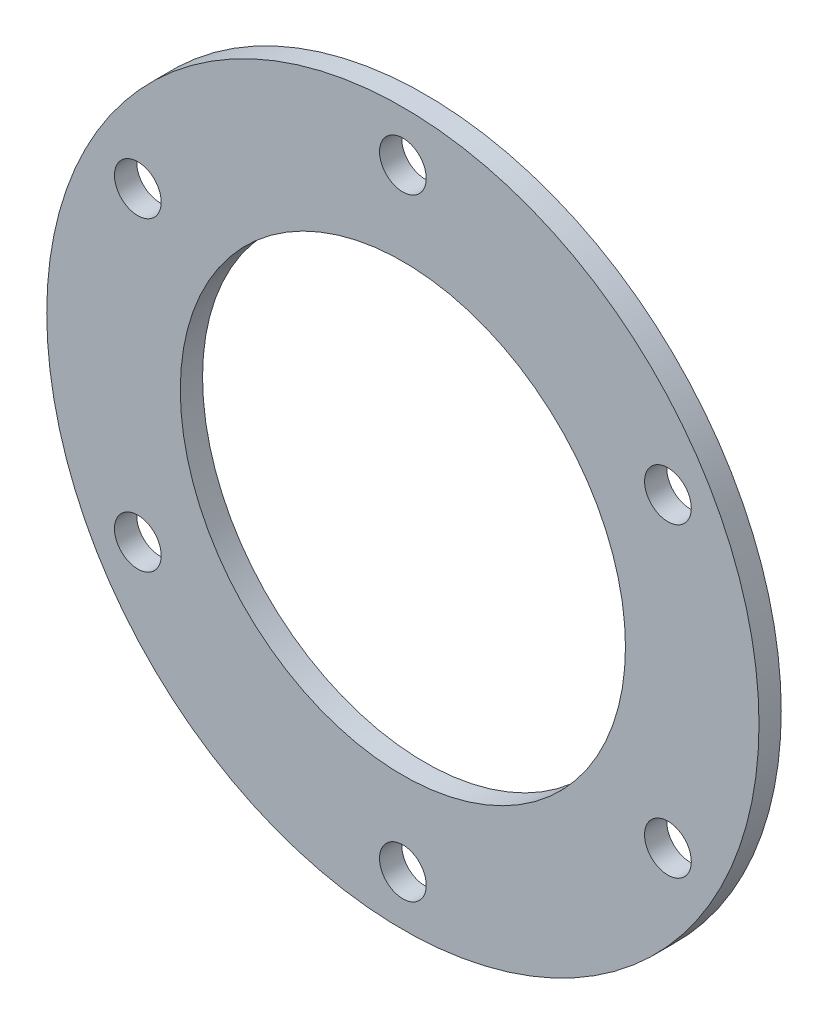
ISO-10303-21;
HEADER;
FILE_DESCRIPTION(('STEP AP214'),'2;1');
FILE_NAME('part.step','',(''),(''),'','','');
FILE_SCHEMA(('AUTOMOTIVE_DESIGN { 1 0 10303 214 1 1 1 1 }'));
ENDSEC;
DATA;
#1=APPLICATION_CONTEXT('core data for automotive mechanical design processes');
#2=APPLICATION_PROTOCOL_DEFINITION('international standard','automotive_design',2000,#1);
#3=PRODUCT_CONTEXT('',#1,'mechanical');
#4=PRODUCT('Part','Part','',(#3));
#5=PRODUCT_RELATED_PRODUCT_CATEGORY('part','',(#4));
#6=PRODUCT_DEFINITION_FORMATION('','',#4);
#7=PRODUCT_DEFINITION_CONTEXT('part definition',#1,'design');
#8=PRODUCT_DEFINITION('design','',#6,#7);
#9=PRODUCT_DEFINITION_SHAPE('','',#8);
#10=(LENGTH_UNIT() NAMED_UNIT(*) SI_UNIT(.MILLI.,.METRE.));
#11=(NAMED_UNIT(*) PLANE_ANGLE_UNIT() SI_UNIT($,.RADIAN.));
#12=(NAMED_UNIT(*) SI_UNIT($,.STERADIAN.) SOLID_ANGLE_UNIT());
#13=UNCERTAINTY_MEASURE_WITH_UNIT(LENGTH_MEASURE(1.E-05),#10,'distance_accuracy_value','');
#14=(GEOMETRIC_REPRESENTATION_CONTEXT(3) GLOBAL_UNCERTAINTY_ASSIGNED_CONTEXT((#13)) GLOBAL_UNIT_ASSIGNED_CONTEXT((#10,
#11,#12)) REPRESENTATION_CONTEXT('',''));
#15=CARTESIAN_POINT('',(0.,0.,0.));
#16=DIRECTION('',(0.,0.,1.));
#17=DIRECTION('',(1.,0.,0.));
#18=AXIS2_PLACEMENT_3D('',#15,#16,#17);
#19=CARTESIAN_POINT('',(0.,0.,2.));
#20=DIRECTION('',(0.,0.,1.));
#21=DIRECTION('',(1.,0.,0.));
#22=AXIS2_PLACEMENT_3D('',#19,#20,#21);
#23=PLANE('',#22);
#24=CARTESIAN_POINT('',(23.8156986040719,13.7500000000003,2.));
#25=DIRECTION('',(0.,0.,1.));
#26=DIRECTION('',(1.,0.,0.));
#27=AXIS2_PLACEMENT_3D('',#24,#25,#26);
#28=CIRCLE('',#27,2.1);
#29=CARTESIAN_POINT('',(25.9156986040719,13.7500000000003,2.));
#30=VERTEX_POINT('',#29);
#31=EDGE_CURVE('E90',#30,#30,#28,.T.);
#32=ORIENTED_EDGE('',*,*,#31,.F.);
#33=EDGE_LOOP('',(#32));
#34=FACE_BOUND('',#33,.T.);
#35=CARTESIAN_POINT('',(23.8156986040722,-13.7499999999998,2.));
#36=DIRECTION('',(0.,0.,1.));
#37=DIRECTION('',(1.,0.,0.));
#38=AXIS2_PLACEMENT_3D('',#35,#36,#37);
#39=CIRCLE('',#38,2.1);
#40=CARTESIAN_POINT('',(25.9156986040722,-13.7499999999998,2.));
#41=VERTEX_POINT('',#40);
#42=EDGE_CURVE('E84',#41,#41,#39,.T.);
#43=ORIENTED_EDGE('',*,*,#42,.F.);
#44=EDGE_LOOP('',(#43));
#45=FACE_BOUND('',#44,.T.);
#46=CARTESIAN_POINT('',(0.,-27.5,2.));
#47=DIRECTION('',(0.,0.,1.));
#48=DIRECTION('',(1.,0.,0.));
#49=AXIS2_PLACEMENT_3D('',#46,#47,#48);
#50=CIRCLE('',#49,2.1);
#51=CARTESIAN_POINT('',(2.1,-27.5,2.));
#52=VERTEX_POINT('',#51);
#53=EDGE_CURVE('E78',#52,#52,#50,.T.);
#54=ORIENTED_EDGE('',*,*,#53,.F.);
#55=EDGE_LOOP('',(#54));
#56=FACE_BOUND('',#55,.T.);
#57=CARTESIAN_POINT('',(-23.815698604072,-13.7500000000001,2.));
#58=DIRECTION('',(0.,0.,1.));
#59=DIRECTION('',(1.,0.,0.));
#60=AXIS2_PLACEMENT_3D('',#57,#58,#59);
#61=CIRCLE('',#60,2.1);
#62=CARTESIAN_POINT('',(-21.715698604072,-13.7500000000001,2.));
#63=VERTEX_POINT('',#62);
#64=EDGE_CURVE('E72',#63,#63,#61,.T.);
#65=ORIENTED_EDGE('',*,*,#64,.F.);
#66=EDGE_LOOP('',(#65));
#67=FACE_BOUND('',#66,.T.);
#68=CARTESIAN_POINT('',(-23.8156986040721,13.7499999999999,2.));
#69=DIRECTION('',(0.,0.,1.));
#70=DIRECTION('',(1.,0.,0.));
#71=AXIS2_PLACEMENT_3D('',#68,#69,#70);
#72=CIRCLE('',#71,2.1);
#73=CARTESIAN_POINT('',(-21.7156986040721,13.7499999999999,2.));
#74=VERTEX_POINT('',#73);
#75=EDGE_CURVE('E66',#74,#74,#72,.T.);
#76=ORIENTED_EDGE('',*,*,#75,.F.);
#77=EDGE_LOOP('',(#76));
#78=FACE_BOUND('',#77,.T.);
#79=CARTESIAN_POINT('',(0.,27.5,2.));
#80=DIRECTION('',(0.,0.,1.));
#81=DIRECTION('',(1.,0.,0.));
#82=AXIS2_PLACEMENT_3D('',#79,#80,#81);
#83=CIRCLE('',#82,2.1);
#84=CARTESIAN_POINT('',(2.1,27.5,2.));
#85=VERTEX_POINT('',#84);
#86=EDGE_CURVE('E60',#85,#85,#83,.T.);
#87=ORIENTED_EDGE('',*,*,#86,.F.);
#88=EDGE_LOOP('',(#87));
#89=FACE_BOUND('',#88,.T.);
#90=CARTESIAN_POINT('',(0.,0.,2.));
#91=DIRECTION('',(0.,0.,1.));
#92=DIRECTION('',(1.,0.,0.));
#93=AXIS2_PLACEMENT_3D('',#90,#91,#92);
#94=CIRCLE('',#93,32.);
#95=CARTESIAN_POINT('',(32.,0.,2.));
#96=VERTEX_POINT('',#95);
#97=EDGE_CURVE('E10',#96,#96,#94,.T.);
#98=ORIENTED_EDGE('',*,*,#97,.T.);
#99=EDGE_LOOP('',(#98));
#100=FACE_BOUND('',#99,.T.);
#101=CARTESIAN_POINT('',(0.,0.,2.));
#102=DIRECTION('',(0.,0.,1.));
#103=DIRECTION('',(1.,0.,0.));
#104=AXIS2_PLACEMENT_3D('',#101,#102,#103);
#105=CIRCLE('',#104,20.);
#106=CARTESIAN_POINT('',(20.,0.,2.));
#107=VERTEX_POINT('',#106);
#108=EDGE_CURVE('E50',#107,#107,#105,.T.);
#109=ORIENTED_EDGE('',*,*,#108,.F.);
#110=EDGE_LOOP('',(#109));
#111=FACE_BOUND('',#110,.T.);
#112=ADVANCED_FACE('F39',(#34,#45,#56,#67,#78,#89,#100,#111),#23,.T.);
#113=CARTESIAN_POINT('',(0.,0.,0.));
#114=DIRECTION('',(0.,0.,1.));
#115=DIRECTION('',(1.,0.,0.));
#116=AXIS2_PLACEMENT_3D('',#113,#114,#115);
#117=PLANE('',#116);
#118=CARTESIAN_POINT('',(23.8156986040719,13.7500000000003,0.));
#119=DIRECTION('',(0.,0.,1.));
#120=DIRECTION('',(1.,0.,0.));
#121=AXIS2_PLACEMENT_3D('',#118,#119,#120);
#122=CIRCLE('',#121,2.1);
#123=CARTESIAN_POINT('',(25.9156986040719,13.7500000000003,0.));
#124=VERTEX_POINT('',#123);
#125=EDGE_CURVE('E87',#124,#124,#122,.T.);
#126=ORIENTED_EDGE('',*,*,#125,.T.);
#127=EDGE_LOOP('',(#126));
#128=FACE_BOUND('',#127,.T.);
#129=CARTESIAN_POINT('',(23.8156986040722,-13.7499999999998,0.));
#130=DIRECTION('',(0.,0.,1.));
#131=DIRECTION('',(1.,0.,0.));
#132=AXIS2_PLACEMENT_3D('',#129,#130,#131);
#133=CIRCLE('',#132,2.1);
#134=CARTESIAN_POINT('',(25.9156986040722,-13.7499999999998,0.));
#135=VERTEX_POINT('',#134);
#136=EDGE_CURVE('E81',#135,#135,#133,.T.);
#137=ORIENTED_EDGE('',*,*,#136,.T.);
#138=EDGE_LOOP('',(#137));
#139=FACE_BOUND('',#138,.T.);
#140=CARTESIAN_POINT('',(0.,-27.5,0.));
#141=DIRECTION('',(0.,0.,1.));
#142=DIRECTION('',(1.,0.,0.));
#143=AXIS2_PLACEMENT_3D('',#140,#141,#142);
#144=CIRCLE('',#143,2.1);
#145=CARTESIAN_POINT('',(2.1,-27.5,0.));
#146=VERTEX_POINT('',#145);
#147=EDGE_CURVE('E75',#146,#146,#144,.T.);
#148=ORIENTED_EDGE('',*,*,#147,.T.);
#149=EDGE_LOOP('',(#148));
#150=FACE_BOUND('',#149,.T.);
#151=CARTESIAN_POINT('',(-23.815698604072,-13.7500000000001,0.));
#152=DIRECTION('',(0.,0.,1.));
#153=DIRECTION('',(1.,0.,0.));
#154=AXIS2_PLACEMENT_3D('',#151,#152,#153);
#155=CIRCLE('',#154,2.1);
#156=CARTESIAN_POINT('',(-21.715698604072,-13.7500000000001,0.));
#157=VERTEX_POINT('',#156);
#158=EDGE_CURVE('E69',#157,#157,#155,.T.);
#159=ORIENTED_EDGE('',*,*,#158,.T.);
#160=EDGE_LOOP('',(#159));
#161=FACE_BOUND('',#160,.T.);
#162=CARTESIAN_POINT('',(-23.8156986040721,13.7499999999999,0.));
#163=DIRECTION('',(0.,0.,1.));
#164=DIRECTION('',(1.,0.,0.));
#165=AXIS2_PLACEMENT_3D('',#162,#163,#164);
#166=CIRCLE('',#165,2.1);
#167=CARTESIAN_POINT('',(-21.7156986040721,13.7499999999999,0.));
#168=VERTEX_POINT('',#167);
#169=EDGE_CURVE('E63',#168,#168,#166,.T.);
#170=ORIENTED_EDGE('',*,*,#169,.T.);
#171=EDGE_LOOP('',(#170));
#172=FACE_BOUND('',#171,.T.);
#173=CARTESIAN_POINT('',(0.,27.5,0.));
#174=DIRECTION('',(0.,0.,1.));
#175=DIRECTION('',(1.,0.,0.));
#176=AXIS2_PLACEMENT_3D('',#173,#174,#175);
#177=CIRCLE('',#176,2.1);
#178=CARTESIAN_POINT('',(2.1,27.5,0.));
#179=VERTEX_POINT('',#178);
#180=EDGE_CURVE('E55',#179,#179,#177,.T.);
#181=ORIENTED_EDGE('',*,*,#180,.T.);
#182=EDGE_LOOP('',(#181));
#183=FACE_BOUND('',#182,.T.);
#184=CARTESIAN_POINT('',(0.,0.,0.));
#185=DIRECTION('',(0.,0.,1.));
#186=DIRECTION('',(1.,0.,0.));
#187=AXIS2_PLACEMENT_3D('',#184,#185,#186);
#188=CIRCLE('',#187,32.);
#189=CARTESIAN_POINT('',(32.,0.,0.));
#190=VERTEX_POINT('',#189);
#191=EDGE_CURVE('E43',#190,#190,#188,.T.);
#192=ORIENTED_EDGE('',*,*,#191,.F.);
#193=EDGE_LOOP('',(#192));
#194=FACE_BOUND('',#193,.T.);
#195=CARTESIAN_POINT('',(0.,0.,0.));
#196=DIRECTION('',(0.,0.,1.));
#197=DIRECTION('',(1.,0.,0.));
#198=AXIS2_PLACEMENT_3D('',#195,#196,#197);
#199=CIRCLE('',#198,20.);
#200=CARTESIAN_POINT('',(20.,0.,0.));
#201=VERTEX_POINT('',#200);
#202=EDGE_CURVE('E52',#201,#201,#199,.T.);
#203=ORIENTED_EDGE('',*,*,#202,.T.);
#204=EDGE_LOOP('',(#203));
#205=FACE_BOUND('',#204,.T.);
#206=ADVANCED_FACE('F98',(#128,#139,#150,#161,#172,#183,#194,#205),#117,.F.);
#207=CARTESIAN_POINT('',(0.,0.,2.));
#208=DIRECTION('',(0.,0.,-1.));
#209=DIRECTION('',(-1.,0.,0.));
#210=AXIS2_PLACEMENT_3D('',#207,#208,#209);
#211=CYLINDRICAL_SURFACE('',#210,32.);
#212=ORIENTED_EDGE('',*,*,#97,.F.);
#213=EDGE_LOOP('',(#212));
#214=FACE_BOUND('',#213,.T.);
#215=ORIENTED_EDGE('',*,*,#191,.T.);
#216=EDGE_LOOP('',(#215));
#217=FACE_BOUND('',#216,.T.);
#218=ADVANCED_FACE('F41',(#214,#217),#211,.T.);
#219=CARTESIAN_POINT('',(0.,0.,2.));
#220=DIRECTION('',(0.,0.,-1.));
#221=DIRECTION('',(-1.,0.,0.));
#222=AXIS2_PLACEMENT_3D('',#219,#220,#221);
#223=CYLINDRICAL_SURFACE('',#222,20.);
#224=ORIENTED_EDGE('',*,*,#108,.T.);
#225=EDGE_LOOP('',(#224));
#226=FACE_BOUND('',#225,.T.);
#227=ORIENTED_EDGE('',*,*,#202,.F.);
#228=EDGE_LOOP('',(#227));
#229=FACE_BOUND('',#228,.T.);
#230=ADVANCED_FACE('F112',(#226,#229),#223,.F.);
#231=CARTESIAN_POINT('',(0.,27.5,2.));
#232=DIRECTION('',(0.,0.,1.));
#233=DIRECTION('',(1.,0.,0.));
#234=AXIS2_PLACEMENT_3D('',#231,#232,#233);
#235=CYLINDRICAL_SURFACE('',#234,2.1);
#236=ORIENTED_EDGE('',*,*,#180,.F.);
#237=EDGE_LOOP('',(#236));
#238=FACE_BOUND('',#237,.T.);
#239=ORIENTED_EDGE('',*,*,#86,.T.);
#240=EDGE_LOOP('',(#239));
#241=FACE_BOUND('',#240,.T.);
#242=ADVANCED_FACE('F115',(#238,#241),#235,.F.);
#243=CARTESIAN_POINT('',(-23.8156986040721,13.7499999999999,2.));
#244=DIRECTION('',(0.,0.,1.));
#245=DIRECTION('',(1.,0.,0.));
#246=AXIS2_PLACEMENT_3D('',#243,#244,#245);
#247=CYLINDRICAL_SURFACE('',#246,2.1);
#248=ORIENTED_EDGE('',*,*,#169,.F.);
#249=EDGE_LOOP('',(#248));
#250=FACE_BOUND('',#249,.T.);
#251=ORIENTED_EDGE('',*,*,#75,.T.);
#252=EDGE_LOOP('',(#251));
#253=FACE_BOUND('',#252,.T.);
#254=ADVANCED_FACE('F130',(#250,#253),#247,.F.);
#255=CARTESIAN_POINT('',(-23.815698604072,-13.7500000000001,2.));
#256=DIRECTION('',(0.,0.,1.));
#257=DIRECTION('',(1.,0.,0.));
#258=AXIS2_PLACEMENT_3D('',#255,#256,#257);
#259=CYLINDRICAL_SURFACE('',#258,2.1);
#260=ORIENTED_EDGE('',*,*,#158,.F.);
#261=EDGE_LOOP('',(#260));
#262=FACE_BOUND('',#261,.T.);
#263=ORIENTED_EDGE('',*,*,#64,.T.);
#264=EDGE_LOOP('',(#263));
#265=FACE_BOUND('',#264,.T.);
#266=ADVANCED_FACE('F133',(#262,#265),#259,.F.);
#267=CARTESIAN_POINT('',(0.,-27.5,2.));
#268=DIRECTION('',(0.,0.,1.));
#269=DIRECTION('',(1.,0.,0.));
#270=AXIS2_PLACEMENT_3D('',#267,#268,#269);
#271=CYLINDRICAL_SURFACE('',#270,2.1);
#272=ORIENTED_EDGE('',*,*,#147,.F.);
#273=EDGE_LOOP('',(#272));
#274=FACE_BOUND('',#273,.T.);
#275=ORIENTED_EDGE('',*,*,#53,.T.);
#276=EDGE_LOOP('',(#275));
#277=FACE_BOUND('',#276,.T.);
#278=ADVANCED_FACE('F137',(#274,#277),#271,.F.);
#279=CARTESIAN_POINT('',(23.8156986040722,-13.7499999999998,2.));
#280=DIRECTION('',(0.,0.,1.));
#281=DIRECTION('',(1.,0.,0.));
#282=AXIS2_PLACEMENT_3D('',#279,#280,#281);
#283=CYLINDRICAL_SURFACE('',#282,2.1);
#284=ORIENTED_EDGE('',*,*,#136,.F.);
#285=EDGE_LOOP('',(#284));
#286=FACE_BOUND('',#285,.T.);
#287=ORIENTED_EDGE('',*,*,#42,.T.);
#288=EDGE_LOOP('',(#287));
#289=FACE_BOUND('',#288,.T.);
#290=ADVANCED_FACE('F141',(#286,#289),#283,.F.);
#291=CARTESIAN_POINT('',(23.8156986040719,13.7500000000003,2.));
#292=DIRECTION('',(0.,0.,1.));
#293=DIRECTION('',(1.,0.,0.));
#294=AXIS2_PLACEMENT_3D('',#291,#292,#293);
#295=CYLINDRICAL_SURFACE('',#294,2.1);
#296=ORIENTED_EDGE('',*,*,#125,.F.);
#297=EDGE_LOOP('',(#296));
#298=FACE_BOUND('',#297,.T.);
#299=ORIENTED_EDGE('',*,*,#31,.T.);
#300=EDGE_LOOP('',(#299));
#301=FACE_BOUND('',#300,.T.);
#302=ADVANCED_FACE('F94',(#298,#301),#295,.F.);
#303=CLOSED_SHELL('',(#112,#206,#218,#230,#242,#254,#266,#278,#290,#302));
#304=MANIFOLD_SOLID_BREP('B2',#303);
#305=ADVANCED_BREP_SHAPE_REPRESENTATION('',(#18,#304),#14);
#306=SHAPE_DEFINITION_REPRESENTATION(#9,#305);
ENDSEC;
END-ISO-10303-21;
